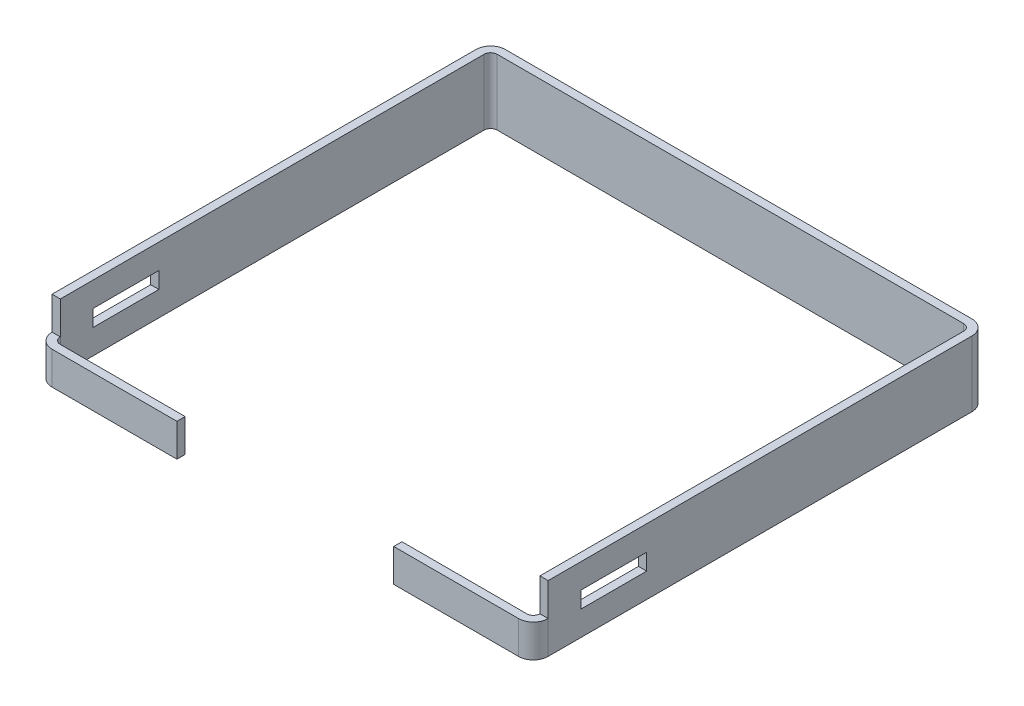
ISO-10303-21;
HEADER;
FILE_DESCRIPTION(('STEP AP214'),'2;1');
FILE_NAME('part.step','',(''),(''),'','','');
FILE_SCHEMA(('AUTOMOTIVE_DESIGN { 1 0 10303 214 1 1 1 1 }'));
ENDSEC;
DATA;
#1=APPLICATION_CONTEXT('core data for automotive mechanical design processes');
#2=APPLICATION_PROTOCOL_DEFINITION('international standard','automotive_design',2000,#1);
#3=PRODUCT_CONTEXT('',#1,'mechanical');
#4=PRODUCT('Part','Part','',(#3));
#5=PRODUCT_RELATED_PRODUCT_CATEGORY('part','',(#4));
#6=PRODUCT_DEFINITION_FORMATION('','',#4);
#7=PRODUCT_DEFINITION_CONTEXT('part definition',#1,'design');
#8=PRODUCT_DEFINITION('design','',#6,#7);
#9=PRODUCT_DEFINITION_SHAPE('','',#8);
#10=(LENGTH_UNIT() NAMED_UNIT(*) SI_UNIT(.MILLI.,.METRE.));
#11=(NAMED_UNIT(*) PLANE_ANGLE_UNIT() SI_UNIT($,.RADIAN.));
#12=(NAMED_UNIT(*) SI_UNIT($,.STERADIAN.) SOLID_ANGLE_UNIT());
#13=UNCERTAINTY_MEASURE_WITH_UNIT(LENGTH_MEASURE(1.E-05),#10,'distance_accuracy_value','');
#14=(GEOMETRIC_REPRESENTATION_CONTEXT(3) GLOBAL_UNCERTAINTY_ASSIGNED_CONTEXT((#13)) GLOBAL_UNIT_ASSIGNED_CONTEXT((#10,
#11,#12)) REPRESENTATION_CONTEXT('',''));
#15=CARTESIAN_POINT('',(0.,0.,0.));
#16=DIRECTION('',(0.,0.,1.));
#17=DIRECTION('',(1.,0.,0.));
#18=AXIS2_PLACEMENT_3D('',#15,#16,#17);
#19=CARTESIAN_POINT('',(-95.885,25.4,172.085));
#20=DIRECTION('',(0.,0.,-1.));
#21=DIRECTION('',(-1.,0.,0.));
#22=AXIS2_PLACEMENT_3D('',#19,#20,#21);
#23=PLANE('',#22);
#24=DIRECTION('',(1.,0.,0.));
#25=VECTOR('',#24,1.);
#26=CARTESIAN_POINT('',(-95.885,12.7,172.085));
#27=LINE('',#26,#25);
#28=CARTESIAN_POINT('',(-90.17,12.7,172.085));
#29=VERTEX_POINT('',#28);
#30=CARTESIAN_POINT('',(-41.91,12.7,172.085));
#31=VERTEX_POINT('',#30);
#32=EDGE_CURVE('E293',#29,#31,#27,.T.);
#33=ORIENTED_EDGE('',*,*,#32,.F.);
#34=DIRECTION('',(0.,-1.,0.));
#35=VECTOR('',#34,1.);
#36=CARTESIAN_POINT('',(-90.17,25.4,172.085));
#37=LINE('',#36,#35);
#38=CARTESIAN_POINT('',(-90.17,0.,172.085));
#39=VERTEX_POINT('',#38);
#40=EDGE_CURVE('E417',#29,#39,#37,.T.);
#41=ORIENTED_EDGE('',*,*,#40,.T.);
#42=DIRECTION('',(1.,0.,0.));
#43=VECTOR('',#42,1.);
#44=CARTESIAN_POINT('',(-95.885,0.,172.085));
#45=LINE('',#44,#43);
#46=CARTESIAN_POINT('',(-41.91,0.,172.085));
#47=VERTEX_POINT('',#46);
#48=EDGE_CURVE('E344',#39,#47,#45,.T.);
#49=ORIENTED_EDGE('',*,*,#48,.T.);
#50=DIRECTION('',(0.,-1.,0.));
#51=VECTOR('',#50,1.);
#52=CARTESIAN_POINT('',(-41.91,25.4,172.085));
#53=LINE('',#52,#51);
#54=EDGE_CURVE('E381',#31,#47,#53,.T.);
#55=ORIENTED_EDGE('',*,*,#54,.F.);
#56=EDGE_LOOP('',(#33,#41,#49,#55));
#57=FACE_BOUND('',#56,.T.);
#58=ADVANCED_FACE('F33',(#57),#23,.F.);
#59=CARTESIAN_POINT('',(-41.91,25.4,168.91));
#60=DIRECTION('',(-1.,0.,0.));
#61=DIRECTION('',(0.,0.,1.));
#62=AXIS2_PLACEMENT_3D('',#59,#60,#61);
#63=PLANE('',#62);
#64=DIRECTION('',(0.,0.,-1.));
#65=VECTOR('',#64,1.);
#66=CARTESIAN_POINT('',(-41.91,12.7,168.91));
#67=LINE('',#66,#65);
#68=CARTESIAN_POINT('',(-41.91,12.7,168.91));
#69=VERTEX_POINT('',#68);
#70=EDGE_CURVE('E310',#31,#69,#67,.T.);
#71=ORIENTED_EDGE('',*,*,#70,.F.);
#72=ORIENTED_EDGE('',*,*,#54,.T.);
#73=DIRECTION('',(0.,0.,-1.));
#74=VECTOR('',#73,1.);
#75=CARTESIAN_POINT('',(-41.91,0.,168.91));
#76=LINE('',#75,#74);
#77=CARTESIAN_POINT('',(-41.91,0.,168.91));
#78=VERTEX_POINT('',#77);
#79=EDGE_CURVE('E347',#47,#78,#76,.T.);
#80=ORIENTED_EDGE('',*,*,#79,.T.);
#81=DIRECTION('',(0.,-1.,0.));
#82=VECTOR('',#81,1.);
#83=CARTESIAN_POINT('',(-41.91,25.4,168.91));
#84=LINE('',#83,#82);
#85=EDGE_CURVE('E379',#69,#78,#84,.T.);
#86=ORIENTED_EDGE('',*,*,#85,.F.);
#87=EDGE_LOOP('',(#71,#72,#80,#86));
#88=FACE_BOUND('',#87,.T.);
#89=ADVANCED_FACE('F527',(#88),#63,.F.);
#90=CARTESIAN_POINT('',(-92.71,25.4,168.91));
#91=DIRECTION('',(0.,0.,1.));
#92=DIRECTION('',(1.,0.,0.));
#93=AXIS2_PLACEMENT_3D('',#90,#91,#92);
#94=PLANE('',#93);
#95=DIRECTION('',(-1.,0.,0.));
#96=VECTOR('',#95,1.);
#97=CARTESIAN_POINT('',(-92.71,12.7,168.91));
#98=LINE('',#97,#96);
#99=CARTESIAN_POINT('',(-90.17,12.7,168.91));
#100=VERTEX_POINT('',#99);
#101=EDGE_CURVE('E308',#69,#100,#98,.T.);
#102=ORIENTED_EDGE('',*,*,#101,.F.);
#103=ORIENTED_EDGE('',*,*,#85,.T.);
#104=DIRECTION('',(-1.,0.,0.));
#105=VECTOR('',#104,1.);
#106=CARTESIAN_POINT('',(-92.71,0.,168.91));
#107=LINE('',#106,#105);
#108=CARTESIAN_POINT('',(-90.17,0.,168.91));
#109=VERTEX_POINT('',#108);
#110=EDGE_CURVE('E350',#78,#109,#107,.T.);
#111=ORIENTED_EDGE('',*,*,#110,.T.);
#112=DIRECTION('',(0.,-1.,0.));
#113=VECTOR('',#112,1.);
#114=CARTESIAN_POINT('',(-90.17,25.4,168.91));
#115=LINE('',#114,#113);
#116=EDGE_CURVE('E397',#109,#100,#115,.F.);
#117=ORIENTED_EDGE('',*,*,#116,.T.);
#118=EDGE_LOOP('',(#102,#103,#111,#117));
#119=FACE_BOUND('',#118,.T.);
#120=ADVANCED_FACE('F524',(#119),#94,.F.);
#121=CARTESIAN_POINT('',(92.7100000000001,25.4,168.91));
#122=DIRECTION('',(0.,0.,1.));
#123=DIRECTION('',(1.,0.,0.));
#124=AXIS2_PLACEMENT_3D('',#121,#122,#123);
#125=PLANE('',#124);
#126=DIRECTION('',(-1.,0.,0.));
#127=VECTOR('',#126,1.);
#128=CARTESIAN_POINT('',(92.7100000000001,12.7,168.91));
#129=LINE('',#128,#127);
#130=CARTESIAN_POINT('',(90.1700000000001,12.7,168.91));
#131=VERTEX_POINT('',#130);
#132=CARTESIAN_POINT('',(41.9100000000001,12.7,168.91));
#133=VERTEX_POINT('',#132);
#134=EDGE_CURVE('E314',#131,#133,#129,.T.);
#135=ORIENTED_EDGE('',*,*,#134,.F.);
#136=DIRECTION('',(0.,-1.,0.));
#137=VECTOR('',#136,1.);
#138=CARTESIAN_POINT('',(90.1700000000001,0.,168.91));
#139=LINE('',#138,#137);
#140=CARTESIAN_POINT('',(90.1700000000001,0.,168.91));
#141=VERTEX_POINT('',#140);
#142=EDGE_CURVE('E383',#131,#141,#139,.T.);
#143=ORIENTED_EDGE('',*,*,#142,.T.);
#144=DIRECTION('',(-1.,0.,0.));
#145=VECTOR('',#144,1.);
#146=CARTESIAN_POINT('',(92.7100000000001,0.,168.91));
#147=LINE('',#146,#145);
#148=CARTESIAN_POINT('',(41.9100000000001,0.,168.91));
#149=VERTEX_POINT('',#148);
#150=EDGE_CURVE('E362',#141,#149,#147,.T.);
#151=ORIENTED_EDGE('',*,*,#150,.T.);
#152=DIRECTION('',(0.,-1.,0.));
#153=VECTOR('',#152,1.);
#154=CARTESIAN_POINT('',(41.9100000000001,25.4,168.91));
#155=LINE('',#154,#153);
#156=EDGE_CURVE('E377',#133,#149,#155,.T.);
#157=ORIENTED_EDGE('',*,*,#156,.F.);
#158=EDGE_LOOP('',(#135,#143,#151,#157));
#159=FACE_BOUND('',#158,.T.);
#160=ADVANCED_FACE('F514',(#159),#125,.F.);
#161=CARTESIAN_POINT('',(41.9100000000001,25.4,168.91));
#162=DIRECTION('',(1.,0.,0.));
#163=DIRECTION('',(0.,0.,-1.));
#164=AXIS2_PLACEMENT_3D('',#161,#162,#163);
#165=PLANE('',#164);
#166=DIRECTION('',(0.,0.,1.));
#167=VECTOR('',#166,1.);
#168=CARTESIAN_POINT('',(41.9100000000001,12.7,168.91));
#169=LINE('',#168,#167);
#170=CARTESIAN_POINT('',(41.9100000000001,12.7,172.085));
#171=VERTEX_POINT('',#170);
#172=EDGE_CURVE('E316',#133,#171,#169,.T.);
#173=ORIENTED_EDGE('',*,*,#172,.F.);
#174=ORIENTED_EDGE('',*,*,#156,.T.);
#175=DIRECTION('',(0.,0.,1.));
#176=VECTOR('',#175,1.);
#177=CARTESIAN_POINT('',(41.9100000000001,0.,168.91));
#178=LINE('',#177,#176);
#179=CARTESIAN_POINT('',(41.9100000000001,0.,172.085));
#180=VERTEX_POINT('',#179);
#181=EDGE_CURVE('E365',#149,#180,#178,.T.);
#182=ORIENTED_EDGE('',*,*,#181,.T.);
#183=DIRECTION('',(0.,-1.,0.));
#184=VECTOR('',#183,1.);
#185=CARTESIAN_POINT('',(41.9100000000001,25.4,172.085));
#186=LINE('',#185,#184);
#187=EDGE_CURVE('E341',#171,#180,#186,.T.);
#188=ORIENTED_EDGE('',*,*,#187,.F.);
#189=EDGE_LOOP('',(#173,#174,#182,#188));
#190=FACE_BOUND('',#189,.T.);
#191=ADVANCED_FACE('F516',(#190),#165,.F.);
#192=CARTESIAN_POINT('',(95.885,25.4,172.085));
#193=DIRECTION('',(0.,0.,-1.));
#194=DIRECTION('',(-1.,0.,0.));
#195=AXIS2_PLACEMENT_3D('',#192,#193,#194);
#196=PLANE('',#195);
#197=CARTESIAN_POINT('',(90.17,12.7,172.085));
#198=VERTEX_POINT('',#197);
#199=EDGE_CURVE('E291',#171,#198,#27,.T.);
#200=ORIENTED_EDGE('',*,*,#199,.F.);
#201=ORIENTED_EDGE('',*,*,#187,.T.);
#202=DIRECTION('',(1.,0.,0.));
#203=VECTOR('',#202,1.);
#204=CARTESIAN_POINT('',(95.885,0.,172.085));
#205=LINE('',#204,#203);
#206=CARTESIAN_POINT('',(90.17,0.,172.085));
#207=VERTEX_POINT('',#206);
#208=EDGE_CURVE('E368',#180,#207,#205,.T.);
#209=ORIENTED_EDGE('',*,*,#208,.T.);
#210=DIRECTION('',(0.,-1.,0.));
#211=VECTOR('',#210,1.);
#212=CARTESIAN_POINT('',(90.17,25.4,172.085));
#213=LINE('',#212,#211);
#214=EDGE_CURVE('E443',#207,#198,#213,.F.);
#215=ORIENTED_EDGE('',*,*,#214,.T.);
#216=EDGE_LOOP('',(#200,#201,#209,#215));
#217=FACE_BOUND('',#216,.T.);
#218=ADVANCED_FACE('F484',(#217),#196,.F.);
#219=CARTESIAN_POINT('',(90.1700000000001,25.4,166.37));
#220=DIRECTION('',(0.,1.,0.));
#221=DIRECTION('',(0.,0.,1.));
#222=AXIS2_PLACEMENT_3D('',#219,#220,#221);
#223=CYLINDRICAL_SURFACE('',#222,2.54);
#224=CARTESIAN_POINT('',(90.1700000000001,12.7,166.37));
#225=DIRECTION('',(0.,1.,0.));
#226=DIRECTION('',(0.,0.,1.));
#227=AXIS2_PLACEMENT_3D('',#224,#225,#226);
#228=CIRCLE('',#227,2.54);
#229=CARTESIAN_POINT('',(92.7100000000001,12.7,166.37));
#230=VERTEX_POINT('',#229);
#231=EDGE_CURVE('E312',#230,#131,#228,.F.);
#232=ORIENTED_EDGE('',*,*,#231,.F.);
#233=DIRECTION('',(0.,-1.,0.));
#234=VECTOR('',#233,1.);
#235=CARTESIAN_POINT('',(92.7100000000001,25.4,166.37));
#236=LINE('',#235,#234);
#237=CARTESIAN_POINT('',(92.7100000000001,0.,166.37));
#238=VERTEX_POINT('',#237);
#239=EDGE_CURVE('E388',#238,#230,#236,.F.);
#240=ORIENTED_EDGE('',*,*,#239,.F.);
#241=CARTESIAN_POINT('',(90.1700000000001,0.,166.37));
#242=DIRECTION('',(0.,1.,0.));
#243=DIRECTION('',(0.,0.,1.));
#244=AXIS2_PLACEMENT_3D('',#241,#242,#243);
#245=CIRCLE('',#244,2.54);
#246=EDGE_CURVE('E405',#141,#238,#245,.T.);
#247=ORIENTED_EDGE('',*,*,#246,.F.);
#248=ORIENTED_EDGE('',*,*,#142,.F.);
#249=EDGE_LOOP('',(#232,#240,#247,#248));
#250=FACE_BOUND('',#249,.T.);
#251=ADVANCED_FACE('F509',(#250),#223,.F.);
#252=CARTESIAN_POINT('',(-90.17,25.4,166.37));
#253=DIRECTION('',(0.,1.,0.));
#254=DIRECTION('',(0.,0.,1.));
#255=AXIS2_PLACEMENT_3D('',#252,#253,#254);
#256=CYLINDRICAL_SURFACE('',#255,2.54);
#257=CARTESIAN_POINT('',(-90.17,12.7,166.37));
#258=DIRECTION('',(0.,1.,0.));
#259=DIRECTION('',(0.,0.,1.));
#260=AXIS2_PLACEMENT_3D('',#257,#258,#259);
#261=CIRCLE('',#260,2.54);
#262=CARTESIAN_POINT('',(-92.71,12.7,166.37));
#263=VERTEX_POINT('',#262);
#264=EDGE_CURVE('E306',#100,#263,#261,.F.);
#265=ORIENTED_EDGE('',*,*,#264,.F.);
#266=ORIENTED_EDGE('',*,*,#116,.F.);
#267=CARTESIAN_POINT('',(-90.17,0.,166.37));
#268=DIRECTION('',(0.,1.,0.));
#269=DIRECTION('',(0.,0.,1.));
#270=AXIS2_PLACEMENT_3D('',#267,#268,#269);
#271=CIRCLE('',#270,2.54);
#272=CARTESIAN_POINT('',(-92.71,0.,166.37));
#273=VERTEX_POINT('',#272);
#274=EDGE_CURVE('E407',#273,#109,#271,.T.);
#275=ORIENTED_EDGE('',*,*,#274,.F.);
#276=DIRECTION('',(0.,-1.,0.));
#277=VECTOR('',#276,1.);
#278=CARTESIAN_POINT('',(-92.71,0.,166.37));
#279=LINE('',#278,#277);
#280=EDGE_CURVE('E393',#263,#273,#279,.T.);
#281=ORIENTED_EDGE('',*,*,#280,.F.);
#282=EDGE_LOOP('',(#265,#266,#275,#281));
#283=FACE_BOUND('',#282,.T.);
#284=ADVANCED_FACE('F543',(#283),#256,.F.);
#285=CARTESIAN_POINT('',(-90.17,25.4,166.37));
#286=DIRECTION('',(0.,-1.,0.));
#287=DIRECTION('',(0.,0.,-1.));
#288=AXIS2_PLACEMENT_3D('',#285,#286,#287);
#289=CYLINDRICAL_SURFACE('',#288,5.715);
#290=ORIENTED_EDGE('',*,*,#40,.F.);
#291=CARTESIAN_POINT('',(-90.17,12.7,166.37));
#292=DIRECTION('',(0.,1.,0.));
#293=DIRECTION('',(0.,0.,1.));
#294=AXIS2_PLACEMENT_3D('',#291,#292,#293);
#295=CIRCLE('',#294,5.715);
#296=CARTESIAN_POINT('',(-95.885,12.7,166.37));
#297=VERTEX_POINT('',#296);
#298=EDGE_CURVE('E303',#29,#297,#295,.F.);
#299=ORIENTED_EDGE('',*,*,#298,.T.);
#300=DIRECTION('',(0.,-1.,0.));
#301=VECTOR('',#300,1.);
#302=CARTESIAN_POINT('',(-95.885,25.4,166.37));
#303=LINE('',#302,#301);
#304=CARTESIAN_POINT('',(-95.885,0.,166.37));
#305=VERTEX_POINT('',#304);
#306=EDGE_CURVE('E430',#305,#297,#303,.F.);
#307=ORIENTED_EDGE('',*,*,#306,.F.);
#308=CARTESIAN_POINT('',(-90.17,0.,166.37));
#309=DIRECTION('',(0.,1.,0.));
#310=DIRECTION('',(0.,0.,1.));
#311=AXIS2_PLACEMENT_3D('',#308,#309,#310);
#312=CIRCLE('',#311,5.715);
#313=EDGE_CURVE('E425',#39,#305,#312,.F.);
#314=ORIENTED_EDGE('',*,*,#313,.F.);
#315=EDGE_LOOP('',(#290,#299,#307,#314));
#316=FACE_BOUND('',#315,.T.);
#317=ADVANCED_FACE('F546',(#316),#289,.T.);
#318=CARTESIAN_POINT('',(90.17,25.4,166.37));
#319=DIRECTION('',(0.,-1.,0.));
#320=DIRECTION('',(0.,0.,-1.));
#321=AXIS2_PLACEMENT_3D('',#318,#319,#320);
#322=CYLINDRICAL_SURFACE('',#321,5.715);
#323=DIRECTION('',(0.,-1.,0.));
#324=VECTOR('',#323,1.);
#325=CARTESIAN_POINT('',(95.885,25.4,166.37));
#326=LINE('',#325,#324);
#327=CARTESIAN_POINT('',(95.885,12.7,166.37));
#328=VERTEX_POINT('',#327);
#329=CARTESIAN_POINT('',(95.885,0.,166.37));
#330=VERTEX_POINT('',#329);
#331=EDGE_CURVE('E439',#328,#330,#326,.T.);
#332=ORIENTED_EDGE('',*,*,#331,.F.);
#333=CARTESIAN_POINT('',(90.17,12.7,166.37));
#334=DIRECTION('',(0.,1.,0.));
#335=DIRECTION('',(0.,0.,1.));
#336=AXIS2_PLACEMENT_3D('',#333,#334,#335);
#337=CIRCLE('',#336,5.715);
#338=EDGE_CURVE('E11',#328,#198,#337,.F.);
#339=ORIENTED_EDGE('',*,*,#338,.T.);
#340=ORIENTED_EDGE('',*,*,#214,.F.);
#341=CARTESIAN_POINT('',(90.17,0.,166.37));
#342=DIRECTION('',(0.,1.,0.));
#343=DIRECTION('',(0.,0.,1.));
#344=AXIS2_PLACEMENT_3D('',#341,#342,#343);
#345=CIRCLE('',#344,5.715);
#346=EDGE_CURVE('E423',#330,#207,#345,.F.);
#347=ORIENTED_EDGE('',*,*,#346,.F.);
#348=EDGE_LOOP('',(#332,#339,#340,#347));
#349=FACE_BOUND('',#348,.T.);
#350=ADVANCED_FACE('F486',(#349),#322,.T.);
#351=CARTESIAN_POINT('',(-95.885,25.4,-3.175));
#352=DIRECTION('',(1.,0.,0.));
#353=DIRECTION('',(0.,0.,-1.));
#354=AXIS2_PLACEMENT_3D('',#351,#352,#353);
#355=PLANE('',#354);
#356=DIRECTION('',(0.,-1.,0.));
#357=VECTOR('',#356,1.);
#358=CARTESIAN_POINT('',(-95.885,15.875,128.27));
#359=LINE('',#358,#357);
#360=CARTESIAN_POINT('',(-95.885,15.875,128.27));
#361=VERTEX_POINT('',#360);
#362=CARTESIAN_POINT('',(-95.885,9.525,128.27));
#363=VERTEX_POINT('',#362);
#364=EDGE_CURVE('E242',#361,#363,#359,.T.);
#365=ORIENTED_EDGE('',*,*,#364,.F.);
#366=DIRECTION('',(0.,0.,-1.));
#367=VECTOR('',#366,1.);
#368=CARTESIAN_POINT('',(-95.885,15.875,153.67));
#369=LINE('',#368,#367);
#370=CARTESIAN_POINT('',(-95.885,15.875,153.67));
#371=VERTEX_POINT('',#370);
#372=EDGE_CURVE('E48',#371,#361,#369,.T.);
#373=ORIENTED_EDGE('',*,*,#372,.F.);
#374=DIRECTION('',(0.,1.,0.));
#375=VECTOR('',#374,1.);
#376=CARTESIAN_POINT('',(-95.885,9.525,153.67));
#377=LINE('',#376,#375);
#378=CARTESIAN_POINT('',(-95.885,9.525,153.67));
#379=VERTEX_POINT('',#378);
#380=EDGE_CURVE('E250',#379,#371,#377,.T.);
#381=ORIENTED_EDGE('',*,*,#380,.F.);
#382=DIRECTION('',(0.,0.,1.));
#383=VECTOR('',#382,1.);
#384=CARTESIAN_POINT('',(-95.885,9.525,128.27));
#385=LINE('',#384,#383);
#386=EDGE_CURVE('E233',#363,#379,#385,.T.);
#387=ORIENTED_EDGE('',*,*,#386,.F.);
#388=EDGE_LOOP('',(#365,#373,#381,#387));
#389=FACE_BOUND('',#388,.T.);
#390=DIRECTION('',(0.,0.,1.));
#391=VECTOR('',#390,1.);
#392=CARTESIAN_POINT('',(-95.885,0.,-3.175));
#393=LINE('',#392,#391);
#394=CARTESIAN_POINT('',(-95.885,0.,2.54));
#395=VERTEX_POINT('',#394);
#396=EDGE_CURVE('E321',#395,#305,#393,.T.);
#397=ORIENTED_EDGE('',*,*,#396,.T.);
#398=ORIENTED_EDGE('',*,*,#306,.T.);
#399=DIRECTION('',(0.,1.,0.));
#400=VECTOR('',#399,1.);
#401=CARTESIAN_POINT('',(-95.885,12.7,166.37));
#402=LINE('',#401,#400);
#403=CARTESIAN_POINT('',(-95.885,25.4,166.37));
#404=VERTEX_POINT('',#403);
#405=EDGE_CURVE('E298',#297,#404,#402,.T.);
#406=ORIENTED_EDGE('',*,*,#405,.T.);
#407=DIRECTION('',(0.,0.,1.));
#408=VECTOR('',#407,1.);
#409=CARTESIAN_POINT('',(-95.885,25.4,-3.175));
#410=LINE('',#409,#408);
#411=CARTESIAN_POINT('',(-95.885,25.4,2.54));
#412=VERTEX_POINT('',#411);
#413=EDGE_CURVE('E322',#412,#404,#410,.T.);
#414=ORIENTED_EDGE('',*,*,#413,.F.);
#415=DIRECTION('',(0.,-1.,0.));
#416=VECTOR('',#415,1.);
#417=CARTESIAN_POINT('',(-95.885,25.4,2.54));
#418=LINE('',#417,#416);
#419=EDGE_CURVE('E427',#412,#395,#418,.T.);
#420=ORIENTED_EDGE('',*,*,#419,.T.);
#421=EDGE_LOOP('',(#397,#398,#406,#414,#420));
#422=FACE_BOUND('',#421,.T.);
#423=ADVANCED_FACE('F247',(#389,#422),#355,.F.);
#424=CARTESIAN_POINT('',(-92.71,25.4,0.));
#425=DIRECTION('',(-1.,0.,0.));
#426=DIRECTION('',(0.,0.,1.));
#427=AXIS2_PLACEMENT_3D('',#424,#425,#426);
#428=PLANE('',#427);
#429=DIRECTION('',(0.,1.,0.));
#430=VECTOR('',#429,1.);
#431=CARTESIAN_POINT('',(-92.71,25.4,153.67));
#432=LINE('',#431,#430);
#433=CARTESIAN_POINT('',(-92.7099999999999,9.525,153.67));
#434=VERTEX_POINT('',#433);
#435=CARTESIAN_POINT('',(-92.7099999999999,15.875,153.67));
#436=VERTEX_POINT('',#435);
#437=EDGE_CURVE('E281',#434,#436,#432,.T.);
#438=ORIENTED_EDGE('',*,*,#437,.T.);
#439=DIRECTION('',(0.,0.,-1.));
#440=VECTOR('',#439,1.);
#441=CARTESIAN_POINT('',(-92.71,15.875,0.));
#442=LINE('',#441,#440);
#443=CARTESIAN_POINT('',(-92.71,15.875,128.27));
#444=VERTEX_POINT('',#443);
#445=EDGE_CURVE('E287',#436,#444,#442,.T.);
#446=ORIENTED_EDGE('',*,*,#445,.T.);
#447=DIRECTION('',(0.,-1.,0.));
#448=VECTOR('',#447,1.);
#449=CARTESIAN_POINT('',(-92.71,25.4,128.27));
#450=LINE('',#449,#448);
#451=CARTESIAN_POINT('',(-92.71,9.52500000000001,128.27));
#452=VERTEX_POINT('',#451);
#453=EDGE_CURVE('E272',#444,#452,#450,.T.);
#454=ORIENTED_EDGE('',*,*,#453,.T.);
#455=DIRECTION('',(0.,0.,1.));
#456=VECTOR('',#455,1.);
#457=CARTESIAN_POINT('',(-92.71,9.52500000000001,0.));
#458=LINE('',#457,#456);
#459=EDGE_CURVE('E236',#452,#434,#458,.T.);
#460=ORIENTED_EDGE('',*,*,#459,.T.);
#461=EDGE_LOOP('',(#438,#446,#454,#460));
#462=FACE_BOUND('',#461,.T.);
#463=DIRECTION('',(0.,0.,-1.));
#464=VECTOR('',#463,1.);
#465=CARTESIAN_POINT('',(-92.71,25.4,0.));
#466=LINE('',#465,#464);
#467=CARTESIAN_POINT('',(-92.71,25.4,166.37));
#468=VERTEX_POINT('',#467);
#469=CARTESIAN_POINT('',(-92.71,25.4,2.54));
#470=VERTEX_POINT('',#469);
#471=EDGE_CURVE('E325',#468,#470,#466,.T.);
#472=ORIENTED_EDGE('',*,*,#471,.F.);
#473=EDGE_CURVE('E394',#468,#263,#279,.T.);
#474=ORIENTED_EDGE('',*,*,#473,.T.);
#475=ORIENTED_EDGE('',*,*,#280,.T.);
#476=DIRECTION('',(0.,0.,-1.));
#477=VECTOR('',#476,1.);
#478=CARTESIAN_POINT('',(-92.71,0.,0.));
#479=LINE('',#478,#477);
#480=CARTESIAN_POINT('',(-92.71,0.,2.54));
#481=VERTEX_POINT('',#480);
#482=EDGE_CURVE('E353',#273,#481,#479,.T.);
#483=ORIENTED_EDGE('',*,*,#482,.T.);
#484=DIRECTION('',(0.,-1.,0.));
#485=VECTOR('',#484,1.);
#486=CARTESIAN_POINT('',(-92.71,25.4,2.54));
#487=LINE('',#486,#485);
#488=EDGE_CURVE('E391',#481,#470,#487,.F.);
#489=ORIENTED_EDGE('',*,*,#488,.T.);
#490=EDGE_LOOP('',(#472,#474,#475,#483,#489));
#491=FACE_BOUND('',#490,.T.);
#492=ADVANCED_FACE('F540',(#462,#491),#428,.F.);
#493=CARTESIAN_POINT('',(-92.71,25.4,0.));
#494=DIRECTION('',(0.,0.,-1.));
#495=DIRECTION('',(-1.,0.,0.));
#496=AXIS2_PLACEMENT_3D('',#493,#494,#495);
#497=PLANE('',#496);
#498=DIRECTION('',(1.,0.,0.));
#499=VECTOR('',#498,1.);
#500=CARTESIAN_POINT('',(-92.71,0.,0.));
#501=LINE('',#500,#499);
#502=CARTESIAN_POINT('',(-90.17,0.,0.));
#503=VERTEX_POINT('',#502);
#504=CARTESIAN_POINT('',(90.1699999999999,0.,0.));
#505=VERTEX_POINT('',#504);
#506=EDGE_CURVE('E356',#503,#505,#501,.T.);
#507=ORIENTED_EDGE('',*,*,#506,.T.);
#508=DIRECTION('',(0.,-1.,0.));
#509=VECTOR('',#508,1.);
#510=CARTESIAN_POINT('',(90.17,25.4,0.));
#511=LINE('',#510,#509);
#512=CARTESIAN_POINT('',(90.1699999999999,25.4,0.));
#513=VERTEX_POINT('',#512);
#514=EDGE_CURVE('E403',#505,#513,#511,.F.);
#515=ORIENTED_EDGE('',*,*,#514,.T.);
#516=DIRECTION('',(1.,0.,0.));
#517=VECTOR('',#516,1.);
#518=CARTESIAN_POINT('',(-92.71,25.4,0.));
#519=LINE('',#518,#517);
#520=CARTESIAN_POINT('',(-90.17,25.4,0.));
#521=VERTEX_POINT('',#520);
#522=EDGE_CURVE('E329',#521,#513,#519,.T.);
#523=ORIENTED_EDGE('',*,*,#522,.F.);
#524=DIRECTION('',(0.,-1.,0.));
#525=VECTOR('',#524,1.);
#526=CARTESIAN_POINT('',(-90.17,0.,0.));
#527=LINE('',#526,#525);
#528=EDGE_CURVE('E400',#521,#503,#527,.T.);
#529=ORIENTED_EDGE('',*,*,#528,.T.);
#530=EDGE_LOOP('',(#507,#515,#523,#529));
#531=FACE_BOUND('',#530,.T.);
#532=ADVANCED_FACE('F603',(#531),#497,.F.);
#533=CARTESIAN_POINT('',(92.71,25.4,0.));
#534=DIRECTION('',(1.,0.,0.));
#535=DIRECTION('',(0.,0.,-1.));
#536=AXIS2_PLACEMENT_3D('',#533,#534,#535);
#537=PLANE('',#536);
#538=DIRECTION('',(0.,1.,0.));
#539=VECTOR('',#538,1.);
#540=CARTESIAN_POINT('',(92.71,25.4,128.27));
#541=LINE('',#540,#539);
#542=CARTESIAN_POINT('',(92.71,9.525,128.27));
#543=VERTEX_POINT('',#542);
#544=CARTESIAN_POINT('',(92.71,15.875,128.27));
#545=VERTEX_POINT('',#544);
#546=EDGE_CURVE('E268',#543,#545,#541,.T.);
#547=ORIENTED_EDGE('',*,*,#546,.T.);
#548=DIRECTION('',(0.,0.,1.));
#549=VECTOR('',#548,1.);
#550=CARTESIAN_POINT('',(92.71,15.875,0.));
#551=LINE('',#550,#549);
#552=CARTESIAN_POINT('',(92.7100000000001,15.875,153.67));
#553=VERTEX_POINT('',#552);
#554=EDGE_CURVE('E284',#545,#553,#551,.T.);
#555=ORIENTED_EDGE('',*,*,#554,.T.);
#556=DIRECTION('',(0.,-1.,0.));
#557=VECTOR('',#556,1.);
#558=CARTESIAN_POINT('',(92.7100000000001,25.4,153.67));
#559=LINE('',#558,#557);
#560=CARTESIAN_POINT('',(92.71,9.525,153.67));
#561=VERTEX_POINT('',#560);
#562=EDGE_CURVE('E278',#553,#561,#559,.T.);
#563=ORIENTED_EDGE('',*,*,#562,.T.);
#564=DIRECTION('',(0.,0.,-1.));
#565=VECTOR('',#564,1.);
#566=CARTESIAN_POINT('',(92.71,9.52500000000001,0.));
#567=LINE('',#566,#565);
#568=EDGE_CURVE('E274',#561,#543,#567,.T.);
#569=ORIENTED_EDGE('',*,*,#568,.T.);
#570=EDGE_LOOP('',(#547,#555,#563,#569));
#571=FACE_BOUND('',#570,.T.);
#572=DIRECTION('',(0.,0.,1.));
#573=VECTOR('',#572,1.);
#574=CARTESIAN_POINT('',(92.71,0.,0.));
#575=LINE('',#574,#573);
#576=CARTESIAN_POINT('',(92.71,0.,2.53999999999997));
#577=VERTEX_POINT('',#576);
#578=EDGE_CURVE('E359',#577,#238,#575,.T.);
#579=ORIENTED_EDGE('',*,*,#578,.T.);
#580=ORIENTED_EDGE('',*,*,#239,.T.);
#581=DIRECTION('',(0.,1.,0.));
#582=VECTOR('',#581,1.);
#583=CARTESIAN_POINT('',(92.7100000000001,25.4,166.37));
#584=LINE('',#583,#582);
#585=CARTESIAN_POINT('',(92.7100000000001,25.4,166.37));
#586=VERTEX_POINT('',#585);
#587=EDGE_CURVE('E318',#230,#586,#584,.T.);
#588=ORIENTED_EDGE('',*,*,#587,.T.);
#589=DIRECTION('',(0.,0.,1.));
#590=VECTOR('',#589,1.);
#591=CARTESIAN_POINT('',(92.71,25.4,0.));
#592=LINE('',#591,#590);
#593=CARTESIAN_POINT('',(92.71,25.4,2.53999999999997));
#594=VERTEX_POINT('',#593);
#595=EDGE_CURVE('E332',#594,#586,#592,.T.);
#596=ORIENTED_EDGE('',*,*,#595,.F.);
#597=DIRECTION('',(0.,-1.,0.));
#598=VECTOR('',#597,1.);
#599=CARTESIAN_POINT('',(92.71,0.,2.53999999999997));
#600=LINE('',#599,#598);
#601=EDGE_CURVE('E385',#594,#577,#600,.T.);
#602=ORIENTED_EDGE('',*,*,#601,.T.);
#603=EDGE_LOOP('',(#579,#580,#588,#596,#602));
#604=FACE_BOUND('',#603,.T.);
#605=ADVANCED_FACE('F495',(#571,#604),#537,.F.);
#606=CARTESIAN_POINT('',(95.885,25.4,-3.175));
#607=DIRECTION('',(-1.,0.,0.));
#608=DIRECTION('',(0.,0.,1.));
#609=AXIS2_PLACEMENT_3D('',#606,#607,#608);
#610=PLANE('',#609);
#611=DIRECTION('',(0.,-1.,0.));
#612=VECTOR('',#611,1.);
#613=CARTESIAN_POINT('',(95.885,9.525,153.67));
#614=LINE('',#613,#612);
#615=CARTESIAN_POINT('',(95.885,15.875,153.67));
#616=VERTEX_POINT('',#615);
#617=CARTESIAN_POINT('',(95.885,9.525,153.67));
#618=VERTEX_POINT('',#617);
#619=EDGE_CURVE('E791',#616,#618,#614,.T.);
#620=ORIENTED_EDGE('',*,*,#619,.F.);
#621=DIRECTION('',(0.,0.,1.));
#622=VECTOR('',#621,1.);
#623=CARTESIAN_POINT('',(95.885,15.875,153.67));
#624=LINE('',#623,#622);
#625=CARTESIAN_POINT('',(95.885,15.875,128.27));
#626=VERTEX_POINT('',#625);
#627=EDGE_CURVE('E269',#626,#616,#624,.T.);
#628=ORIENTED_EDGE('',*,*,#627,.F.);
#629=DIRECTION('',(0.,1.,0.));
#630=VECTOR('',#629,1.);
#631=CARTESIAN_POINT('',(95.885,15.875,128.27));
#632=LINE('',#631,#630);
#633=CARTESIAN_POINT('',(95.885,9.52500000000001,128.27));
#634=VERTEX_POINT('',#633);
#635=EDGE_CURVE('E266',#634,#626,#632,.T.);
#636=ORIENTED_EDGE('',*,*,#635,.F.);
#637=DIRECTION('',(0.,0.,-1.));
#638=VECTOR('',#637,1.);
#639=CARTESIAN_POINT('',(95.885,9.525,128.27));
#640=LINE('',#639,#638);
#641=EDGE_CURVE('E258',#618,#634,#640,.T.);
#642=ORIENTED_EDGE('',*,*,#641,.F.);
#643=EDGE_LOOP('',(#620,#628,#636,#642));
#644=FACE_BOUND('',#643,.T.);
#645=DIRECTION('',(0.,0.,-1.));
#646=VECTOR('',#645,1.);
#647=CARTESIAN_POINT('',(95.885,25.4,-3.175));
#648=LINE('',#647,#646);
#649=CARTESIAN_POINT('',(95.885,25.4,166.37));
#650=VERTEX_POINT('',#649);
#651=CARTESIAN_POINT('',(95.885,25.4,2.54));
#652=VERTEX_POINT('',#651);
#653=EDGE_CURVE('E335',#650,#652,#648,.T.);
#654=ORIENTED_EDGE('',*,*,#653,.F.);
#655=EDGE_CURVE('E440',#650,#328,#326,.T.);
#656=ORIENTED_EDGE('',*,*,#655,.T.);
#657=ORIENTED_EDGE('',*,*,#331,.T.);
#658=DIRECTION('',(0.,0.,-1.));
#659=VECTOR('',#658,1.);
#660=CARTESIAN_POINT('',(95.885,0.,-3.175));
#661=LINE('',#660,#659);
#662=CARTESIAN_POINT('',(95.885,0.,2.54));
#663=VERTEX_POINT('',#662);
#664=EDGE_CURVE('E371',#330,#663,#661,.T.);
#665=ORIENTED_EDGE('',*,*,#664,.T.);
#666=DIRECTION('',(0.,-1.,0.));
#667=VECTOR('',#666,1.);
#668=CARTESIAN_POINT('',(95.885,25.4,2.54));
#669=LINE('',#668,#667);
#670=EDGE_CURVE('E437',#663,#652,#669,.F.);
#671=ORIENTED_EDGE('',*,*,#670,.T.);
#672=EDGE_LOOP('',(#654,#656,#657,#665,#671));
#673=FACE_BOUND('',#672,.T.);
#674=ADVANCED_FACE('F475',(#644,#673),#610,.F.);
#675=CARTESIAN_POINT('',(-95.885,25.4,-3.175));
#676=DIRECTION('',(0.,0.,1.));
#677=DIRECTION('',(1.,0.,0.));
#678=AXIS2_PLACEMENT_3D('',#675,#676,#677);
#679=PLANE('',#678);
#680=DIRECTION('',(-1.,0.,0.));
#681=VECTOR('',#680,1.);
#682=CARTESIAN_POINT('',(-95.885,25.4,-3.175));
#683=LINE('',#682,#681);
#684=CARTESIAN_POINT('',(90.17,25.4,-3.175));
#685=VERTEX_POINT('',#684);
#686=CARTESIAN_POINT('',(-90.17,25.4,-3.175));
#687=VERTEX_POINT('',#686);
#688=EDGE_CURVE('E338',#685,#687,#683,.T.);
#689=ORIENTED_EDGE('',*,*,#688,.F.);
#690=DIRECTION('',(0.,-1.,0.));
#691=VECTOR('',#690,1.);
#692=CARTESIAN_POINT('',(90.17,25.4,-3.175));
#693=LINE('',#692,#691);
#694=CARTESIAN_POINT('',(90.17,0.,-3.175));
#695=VERTEX_POINT('',#694);
#696=EDGE_CURVE('E41',#685,#695,#693,.T.);
#697=ORIENTED_EDGE('',*,*,#696,.T.);
#698=DIRECTION('',(-1.,0.,0.));
#699=VECTOR('',#698,1.);
#700=CARTESIAN_POINT('',(-95.885,0.,-3.175));
#701=LINE('',#700,#699);
#702=CARTESIAN_POINT('',(-90.17,0.,-3.175));
#703=VERTEX_POINT('',#702);
#704=EDGE_CURVE('E326',#695,#703,#701,.T.);
#705=ORIENTED_EDGE('',*,*,#704,.T.);
#706=DIRECTION('',(0.,-1.,0.));
#707=VECTOR('',#706,1.);
#708=CARTESIAN_POINT('',(-90.17,25.4,-3.175));
#709=LINE('',#708,#707);
#710=EDGE_CURVE('E446',#703,#687,#709,.F.);
#711=ORIENTED_EDGE('',*,*,#710,.T.);
#712=EDGE_LOOP('',(#689,#697,#705,#711));
#713=FACE_BOUND('',#712,.T.);
#714=ADVANCED_FACE('F452',(#713),#679,.F.);
#715=CARTESIAN_POINT('',(0.,25.4,0.));
#716=DIRECTION('',(0.,1.,0.));
#717=DIRECTION('',(0.,0.,1.));
#718=AXIS2_PLACEMENT_3D('',#715,#716,#717);
#719=PLANE('',#718);
#720=DIRECTION('',(-1.,0.,0.));
#721=VECTOR('',#720,1.);
#722=CARTESIAN_POINT('',(95.885,25.4,166.37));
#723=LINE('',#722,#721);
#724=EDGE_CURVE('E294',#650,#586,#723,.T.);
#725=ORIENTED_EDGE('',*,*,#724,.F.);
#726=ORIENTED_EDGE('',*,*,#653,.T.);
#727=CARTESIAN_POINT('',(90.17,25.4,2.54));
#728=DIRECTION('',(0.,1.,0.));
#729=DIRECTION('',(0.,0.,1.));
#730=AXIS2_PLACEMENT_3D('',#727,#728,#729);
#731=CIRCLE('',#730,5.715);
#732=EDGE_CURVE('E435',#652,#685,#731,.T.);
#733=ORIENTED_EDGE('',*,*,#732,.T.);
#734=ORIENTED_EDGE('',*,*,#688,.T.);
#735=CARTESIAN_POINT('',(-90.17,25.4,2.54));
#736=DIRECTION('',(0.,1.,0.));
#737=DIRECTION('',(0.,0.,1.));
#738=AXIS2_PLACEMENT_3D('',#735,#736,#737);
#739=CIRCLE('',#738,5.715);
#740=EDGE_CURVE('E433',#687,#412,#739,.T.);
#741=ORIENTED_EDGE('',*,*,#740,.T.);
#742=ORIENTED_EDGE('',*,*,#413,.T.);
#743=EDGE_CURVE('E290',#468,#404,#723,.T.);
#744=ORIENTED_EDGE('',*,*,#743,.F.);
#745=ORIENTED_EDGE('',*,*,#471,.T.);
#746=CARTESIAN_POINT('',(-90.17,25.4,2.54));
#747=DIRECTION('',(0.,1.,0.));
#748=DIRECTION('',(0.,0.,1.));
#749=AXIS2_PLACEMENT_3D('',#746,#747,#748);
#750=CIRCLE('',#749,2.54);
#751=EDGE_CURVE('E415',#470,#521,#750,.F.);
#752=ORIENTED_EDGE('',*,*,#751,.T.);
#753=ORIENTED_EDGE('',*,*,#522,.T.);
#754=CARTESIAN_POINT('',(90.17,25.4,2.53999999999997));
#755=DIRECTION('',(0.,1.,0.));
#756=DIRECTION('',(0.,0.,1.));
#757=AXIS2_PLACEMENT_3D('',#754,#755,#756);
#758=CIRCLE('',#757,2.54);
#759=EDGE_CURVE('E411',#513,#594,#758,.F.);
#760=ORIENTED_EDGE('',*,*,#759,.T.);
#761=ORIENTED_EDGE('',*,*,#595,.T.);
#762=EDGE_LOOP('',(#725,#726,#733,#734,#741,#742,#744,#745,#752,#753,#760,#761));
#763=FACE_BOUND('',#762,.T.);
#764=ADVANCED_FACE('F469',(#763),#719,.T.);
#765=CARTESIAN_POINT('',(0.,0.,0.));
#766=DIRECTION('',(0.,1.,0.));
#767=DIRECTION('',(0.,0.,1.));
#768=AXIS2_PLACEMENT_3D('',#765,#766,#767);
#769=PLANE('',#768);
#770=ORIENTED_EDGE('',*,*,#48,.F.);
#771=ORIENTED_EDGE('',*,*,#313,.T.);
#772=ORIENTED_EDGE('',*,*,#396,.F.);
#773=CARTESIAN_POINT('',(-90.17,0.,2.54));
#774=DIRECTION('',(0.,1.,0.));
#775=DIRECTION('',(0.,0.,1.));
#776=AXIS2_PLACEMENT_3D('',#773,#774,#775);
#777=CIRCLE('',#776,5.715);
#778=EDGE_CURVE('E419',#395,#703,#777,.F.);
#779=ORIENTED_EDGE('',*,*,#778,.T.);
#780=ORIENTED_EDGE('',*,*,#704,.F.);
#781=CARTESIAN_POINT('',(90.17,0.,2.54));
#782=DIRECTION('',(0.,1.,0.));
#783=DIRECTION('',(0.,0.,1.));
#784=AXIS2_PLACEMENT_3D('',#781,#782,#783);
#785=CIRCLE('',#784,5.715);
#786=EDGE_CURVE('E421',#695,#663,#785,.F.);
#787=ORIENTED_EDGE('',*,*,#786,.T.);
#788=ORIENTED_EDGE('',*,*,#664,.F.);
#789=ORIENTED_EDGE('',*,*,#346,.T.);
#790=ORIENTED_EDGE('',*,*,#208,.F.);
#791=ORIENTED_EDGE('',*,*,#181,.F.);
#792=ORIENTED_EDGE('',*,*,#150,.F.);
#793=ORIENTED_EDGE('',*,*,#246,.T.);
#794=ORIENTED_EDGE('',*,*,#578,.F.);
#795=CARTESIAN_POINT('',(90.17,0.,2.53999999999997));
#796=DIRECTION('',(0.,1.,0.));
#797=DIRECTION('',(0.,0.,1.));
#798=AXIS2_PLACEMENT_3D('',#795,#796,#797);
#799=CIRCLE('',#798,2.54);
#800=EDGE_CURVE('E409',#577,#505,#799,.T.);
#801=ORIENTED_EDGE('',*,*,#800,.T.);
#802=ORIENTED_EDGE('',*,*,#506,.F.);
#803=CARTESIAN_POINT('',(-90.17,0.,2.54));
#804=DIRECTION('',(0.,1.,0.));
#805=DIRECTION('',(0.,0.,1.));
#806=AXIS2_PLACEMENT_3D('',#803,#804,#805);
#807=CIRCLE('',#806,2.54);
#808=EDGE_CURVE('E413',#503,#481,#807,.T.);
#809=ORIENTED_EDGE('',*,*,#808,.T.);
#810=ORIENTED_EDGE('',*,*,#482,.F.);
#811=ORIENTED_EDGE('',*,*,#274,.T.);
#812=ORIENTED_EDGE('',*,*,#110,.F.);
#813=ORIENTED_EDGE('',*,*,#79,.F.);
#814=EDGE_LOOP('',(#770,#771,#772,#779,#780,#787,#788,#789,#790,#791,#792,#793,#794,#801,#802,
#809,#810,#811,#812,#813));
#815=FACE_BOUND('',#814,.T.);
#816=ADVANCED_FACE('F458',(#815),#769,.F.);
#817=CARTESIAN_POINT('',(90.17,25.4,2.53999999999997));
#818=DIRECTION('',(0.,1.,0.));
#819=DIRECTION('',(0.,0.,1.));
#820=AXIS2_PLACEMENT_3D('',#817,#818,#819);
#821=CYLINDRICAL_SURFACE('',#820,2.54);
#822=ORIENTED_EDGE('',*,*,#759,.F.);
#823=ORIENTED_EDGE('',*,*,#514,.F.);
#824=ORIENTED_EDGE('',*,*,#800,.F.);
#825=ORIENTED_EDGE('',*,*,#601,.F.);
#826=EDGE_LOOP('',(#822,#823,#824,#825));
#827=FACE_BOUND('',#826,.T.);
#828=ADVANCED_FACE('F502',(#827),#821,.F.);
#829=CARTESIAN_POINT('',(-90.17,25.4,2.54));
#830=DIRECTION('',(0.,1.,0.));
#831=DIRECTION('',(0.,0.,1.));
#832=AXIS2_PLACEMENT_3D('',#829,#830,#831);
#833=CYLINDRICAL_SURFACE('',#832,2.54);
#834=ORIENTED_EDGE('',*,*,#751,.F.);
#835=ORIENTED_EDGE('',*,*,#488,.F.);
#836=ORIENTED_EDGE('',*,*,#808,.F.);
#837=ORIENTED_EDGE('',*,*,#528,.F.);
#838=EDGE_LOOP('',(#834,#835,#836,#837));
#839=FACE_BOUND('',#838,.T.);
#840=ADVANCED_FACE('F550',(#839),#833,.F.);
#841=CARTESIAN_POINT('',(90.17,25.4,2.54));
#842=DIRECTION('',(0.,-1.,0.));
#843=DIRECTION('',(0.,0.,-1.));
#844=AXIS2_PLACEMENT_3D('',#841,#842,#843);
#845=CYLINDRICAL_SURFACE('',#844,5.715);
#846=ORIENTED_EDGE('',*,*,#732,.F.);
#847=ORIENTED_EDGE('',*,*,#670,.F.);
#848=ORIENTED_EDGE('',*,*,#786,.F.);
#849=ORIENTED_EDGE('',*,*,#696,.F.);
#850=EDGE_LOOP('',(#846,#847,#848,#849));
#851=FACE_BOUND('',#850,.T.);
#852=ADVANCED_FACE('F473',(#851),#845,.T.);
#853=CARTESIAN_POINT('',(-90.17,25.4,2.54));
#854=DIRECTION('',(0.,-1.,0.));
#855=DIRECTION('',(0.,0.,-1.));
#856=AXIS2_PLACEMENT_3D('',#853,#854,#855);
#857=CYLINDRICAL_SURFACE('',#856,5.715);
#858=ORIENTED_EDGE('',*,*,#740,.F.);
#859=ORIENTED_EDGE('',*,*,#710,.F.);
#860=ORIENTED_EDGE('',*,*,#778,.F.);
#861=ORIENTED_EDGE('',*,*,#419,.F.);
#862=EDGE_LOOP('',(#858,#859,#860,#861));
#863=FACE_BOUND('',#862,.T.);
#864=ADVANCED_FACE('F35',(#863),#857,.T.);
#865=CARTESIAN_POINT('',(0.,12.7,0.));
#866=DIRECTION('',(0.,1.,0.));
#867=DIRECTION('',(0.,0.,1.));
#868=AXIS2_PLACEMENT_3D('',#865,#866,#867);
#869=PLANE('',#868);
#870=ORIENTED_EDGE('',*,*,#172,.T.);
#871=ORIENTED_EDGE('',*,*,#199,.T.);
#872=ORIENTED_EDGE('',*,*,#338,.F.);
#873=DIRECTION('',(-1.,0.,0.));
#874=VECTOR('',#873,1.);
#875=CARTESIAN_POINT('',(95.885,12.7,166.37));
#876=LINE('',#875,#874);
#877=EDGE_CURVE('E295',#328,#230,#876,.T.);
#878=ORIENTED_EDGE('',*,*,#877,.T.);
#879=ORIENTED_EDGE('',*,*,#231,.T.);
#880=ORIENTED_EDGE('',*,*,#134,.T.);
#881=EDGE_LOOP('',(#870,#871,#872,#878,#879,#880));
#882=FACE_BOUND('',#881,.T.);
#883=ADVANCED_FACE('F489',(#882),#869,.T.);
#884=CARTESIAN_POINT('',(95.885,12.7,166.37));
#885=DIRECTION('',(0.,0.,-1.));
#886=DIRECTION('',(-1.,0.,0.));
#887=AXIS2_PLACEMENT_3D('',#884,#885,#886);
#888=PLANE('',#887);
#889=ORIENTED_EDGE('',*,*,#877,.F.);
#890=ORIENTED_EDGE('',*,*,#655,.F.);
#891=ORIENTED_EDGE('',*,*,#724,.T.);
#892=ORIENTED_EDGE('',*,*,#587,.F.);
#893=EDGE_LOOP('',(#889,#890,#891,#892));
#894=FACE_BOUND('',#893,.T.);
#895=ADVANCED_FACE('F492',(#894),#888,.F.);
#896=ORIENTED_EDGE('',*,*,#743,.T.);
#897=ORIENTED_EDGE('',*,*,#405,.F.);
#898=EDGE_CURVE('E299',#263,#297,#876,.T.);
#899=ORIENTED_EDGE('',*,*,#898,.F.);
#900=ORIENTED_EDGE('',*,*,#473,.F.);
#901=EDGE_LOOP('',(#896,#897,#899,#900));
#902=FACE_BOUND('',#901,.T.);
#903=ADVANCED_FACE('F570',(#902),#888,.F.);
#904=ORIENTED_EDGE('',*,*,#70,.T.);
#905=ORIENTED_EDGE('',*,*,#101,.T.);
#906=ORIENTED_EDGE('',*,*,#264,.T.);
#907=ORIENTED_EDGE('',*,*,#898,.T.);
#908=ORIENTED_EDGE('',*,*,#298,.F.);
#909=ORIENTED_EDGE('',*,*,#32,.T.);
#910=EDGE_LOOP('',(#904,#905,#906,#907,#908,#909));
#911=FACE_BOUND('',#910,.T.);
#912=ADVANCED_FACE('F566',(#911),#869,.T.);
#913=CARTESIAN_POINT('',(122.066720722672,15.875,128.27));
#914=DIRECTION('',(0.,0.,-1.));
#915=DIRECTION('',(-1.,0.,0.));
#916=AXIS2_PLACEMENT_3D('',#913,#914,#915);
#917=PLANE('',#916);
#918=DIRECTION('',(-1.,0.,0.));
#919=VECTOR('',#918,1.);
#920=CARTESIAN_POINT('',(122.066720722672,9.525,128.27));
#921=LINE('',#920,#919);
#922=EDGE_CURVE('E238',#634,#543,#921,.T.);
#923=ORIENTED_EDGE('',*,*,#922,.F.);
#924=ORIENTED_EDGE('',*,*,#635,.T.);
#925=DIRECTION('',(-1.,0.,0.));
#926=VECTOR('',#925,1.);
#927=CARTESIAN_POINT('',(122.066720722672,15.875,128.27));
#928=LINE('',#927,#926);
#929=EDGE_CURVE('E239',#626,#545,#928,.T.);
#930=ORIENTED_EDGE('',*,*,#929,.T.);
#931=ORIENTED_EDGE('',*,*,#546,.F.);
#932=EDGE_LOOP('',(#923,#924,#930,#931));
#933=FACE_BOUND('',#932,.T.);
#934=ADVANCED_FACE('F574',(#933),#917,.F.);
#935=CARTESIAN_POINT('',(122.066720722672,9.525,128.27));
#936=DIRECTION('',(0.,-1.,0.));
#937=DIRECTION('',(0.,0.,-1.));
#938=AXIS2_PLACEMENT_3D('',#935,#936,#937);
#939=PLANE('',#938);
#940=DIRECTION('',(-1.,0.,0.));
#941=VECTOR('',#940,1.);
#942=CARTESIAN_POINT('',(122.066720722672,9.525,153.67));
#943=LINE('',#942,#941);
#944=EDGE_CURVE('E260',#618,#561,#943,.T.);
#945=ORIENTED_EDGE('',*,*,#944,.F.);
#946=ORIENTED_EDGE('',*,*,#641,.T.);
#947=ORIENTED_EDGE('',*,*,#922,.T.);
#948=ORIENTED_EDGE('',*,*,#568,.F.);
#949=EDGE_LOOP('',(#945,#946,#947,#948));
#950=FACE_BOUND('',#949,.T.);
#951=ADVANCED_FACE('F580',(#950),#939,.F.);
#952=CARTESIAN_POINT('',(122.066720722672,9.525,153.67));
#953=DIRECTION('',(0.,0.,1.));
#954=DIRECTION('',(1.,0.,0.));
#955=AXIS2_PLACEMENT_3D('',#952,#953,#954);
#956=PLANE('',#955);
#957=DIRECTION('',(-1.,0.,0.));
#958=VECTOR('',#957,1.);
#959=CARTESIAN_POINT('',(122.066720722672,15.875,153.67));
#960=LINE('',#959,#958);
#961=EDGE_CURVE('E255',#616,#553,#960,.T.);
#962=ORIENTED_EDGE('',*,*,#961,.F.);
#963=ORIENTED_EDGE('',*,*,#619,.T.);
#964=ORIENTED_EDGE('',*,*,#944,.T.);
#965=ORIENTED_EDGE('',*,*,#562,.F.);
#966=EDGE_LOOP('',(#962,#963,#964,#965));
#967=FACE_BOUND('',#966,.T.);
#968=ADVANCED_FACE('F734',(#967),#956,.F.);
#969=CARTESIAN_POINT('',(122.066720722672,15.875,153.67));
#970=DIRECTION('',(0.,1.,0.));
#971=DIRECTION('',(0.,0.,1.));
#972=AXIS2_PLACEMENT_3D('',#969,#970,#971);
#973=PLANE('',#972);
#974=ORIENTED_EDGE('',*,*,#929,.F.);
#975=ORIENTED_EDGE('',*,*,#627,.T.);
#976=ORIENTED_EDGE('',*,*,#961,.T.);
#977=ORIENTED_EDGE('',*,*,#554,.F.);
#978=EDGE_LOOP('',(#974,#975,#976,#977));
#979=FACE_BOUND('',#978,.T.);
#980=ADVANCED_FACE('F744',(#979),#973,.F.);
#981=EDGE_CURVE('E259',#436,#371,#960,.T.);
#982=ORIENTED_EDGE('',*,*,#981,.T.);
#983=ORIENTED_EDGE('',*,*,#372,.T.);
#984=EDGE_CURVE('E244',#444,#361,#928,.T.);
#985=ORIENTED_EDGE('',*,*,#984,.F.);
#986=ORIENTED_EDGE('',*,*,#445,.F.);
#987=EDGE_LOOP('',(#982,#983,#985,#986));
#988=FACE_BOUND('',#987,.T.);
#989=ADVANCED_FACE('F755',(#988),#973,.F.);
#990=EDGE_CURVE('E262',#434,#379,#943,.T.);
#991=ORIENTED_EDGE('',*,*,#990,.T.);
#992=ORIENTED_EDGE('',*,*,#380,.T.);
#993=ORIENTED_EDGE('',*,*,#981,.F.);
#994=ORIENTED_EDGE('',*,*,#437,.F.);
#995=EDGE_LOOP('',(#991,#992,#993,#994));
#996=FACE_BOUND('',#995,.T.);
#997=ADVANCED_FACE('F747',(#996),#956,.F.);
#998=EDGE_CURVE('E56',#452,#363,#921,.T.);
#999=ORIENTED_EDGE('',*,*,#998,.T.);
#1000=ORIENTED_EDGE('',*,*,#386,.T.);
#1001=ORIENTED_EDGE('',*,*,#990,.F.);
#1002=ORIENTED_EDGE('',*,*,#459,.F.);
#1003=EDGE_LOOP('',(#999,#1000,#1001,#1002));
#1004=FACE_BOUND('',#1003,.T.);
#1005=ADVANCED_FACE('F230',(#1004),#939,.F.);
#1006=ORIENTED_EDGE('',*,*,#984,.T.);
#1007=ORIENTED_EDGE('',*,*,#364,.T.);
#1008=ORIENTED_EDGE('',*,*,#998,.F.);
#1009=ORIENTED_EDGE('',*,*,#453,.F.);
#1010=EDGE_LOOP('',(#1006,#1007,#1008,#1009));
#1011=FACE_BOUND('',#1010,.T.);
#1012=ADVANCED_FACE('F243',(#1011),#917,.F.);
#1013=CLOSED_SHELL('',(#58,#89,#120,#160,#191,#218,#251,#284,#317,#350,#423,#492,#532,#605,#674,
#714,#764,#816,#828,#840,#852,#864,#883,#895,#903,#912,#934,#951,#968,#980,#989,#997,#1005,#1012));
#1014=MANIFOLD_SOLID_BREP('B2',#1013);
#1015=ADVANCED_BREP_SHAPE_REPRESENTATION('',(#18,#1014),#14);
#1016=SHAPE_DEFINITION_REPRESENTATION(#9,#1015);
ENDSEC;
END-ISO-10303-21;
